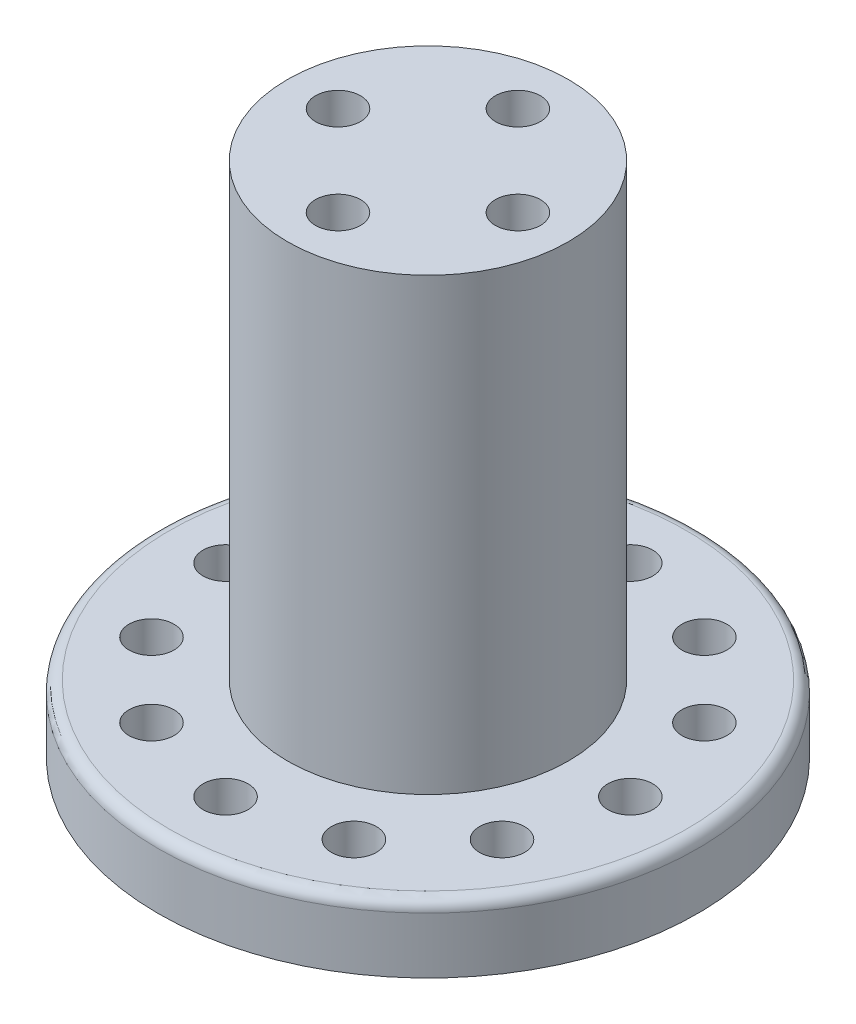
ISO-10303-21;
HEADER;
FILE_DESCRIPTION(('STEP AP214'),'2;1');
FILE_NAME('part.step','',(''),(''),'','','');
FILE_SCHEMA(('AUTOMOTIVE_DESIGN { 1 0 10303 214 1 1 1 1 }'));
ENDSEC;
DATA;
#1=APPLICATION_CONTEXT('core data for automotive mechanical design processes');
#2=APPLICATION_PROTOCOL_DEFINITION('international standard','automotive_design',2000,#1);
#3=PRODUCT_CONTEXT('',#1,'mechanical');
#4=PRODUCT('Part','Part','',(#3));
#5=PRODUCT_RELATED_PRODUCT_CATEGORY('part','',(#4));
#6=PRODUCT_DEFINITION_FORMATION('','',#4);
#7=PRODUCT_DEFINITION_CONTEXT('part definition',#1,'design');
#8=PRODUCT_DEFINITION('design','',#6,#7);
#9=PRODUCT_DEFINITION_SHAPE('','',#8);
#10=(LENGTH_UNIT() NAMED_UNIT(*) SI_UNIT(.MILLI.,.METRE.));
#11=(NAMED_UNIT(*) PLANE_ANGLE_UNIT() SI_UNIT($,.RADIAN.));
#12=(NAMED_UNIT(*) SI_UNIT($,.STERADIAN.) SOLID_ANGLE_UNIT());
#13=UNCERTAINTY_MEASURE_WITH_UNIT(LENGTH_MEASURE(1.E-05),#10,'distance_accuracy_value','');
#14=(GEOMETRIC_REPRESENTATION_CONTEXT(3) GLOBAL_UNCERTAINTY_ASSIGNED_CONTEXT((#13)) GLOBAL_UNIT_ASSIGNED_CONTEXT((#10,
#11,#12)) REPRESENTATION_CONTEXT('',''));
#15=CARTESIAN_POINT('',(0.,0.,0.));
#16=DIRECTION('',(0.,0.,1.));
#17=DIRECTION('',(1.,0.,0.));
#18=AXIS2_PLACEMENT_3D('',#15,#16,#17);
#19=CARTESIAN_POINT('',(0.,6.,0.));
#20=DIRECTION('',(0.,-1.,0.));
#21=DIRECTION('',(0.,0.,-1.));
#22=AXIS2_PLACEMENT_3D('',#19,#20,#21);
#23=CYLINDRICAL_SURFACE('',#22,24.);
#24=CARTESIAN_POINT('',(0.,5.,0.));
#25=DIRECTION('',(0.,1.,0.));
#26=DIRECTION('',(0.,0.,1.));
#27=AXIS2_PLACEMENT_3D('',#24,#25,#26);
#28=CIRCLE('',#27,24.);
#29=CARTESIAN_POINT('',(0.,5.,24.));
#30=VERTEX_POINT('',#29);
#31=EDGE_CURVE('E10',#30,#30,#28,.F.);
#32=ORIENTED_EDGE('',*,*,#31,.T.);
#33=EDGE_LOOP('',(#32));
#34=FACE_BOUND('',#33,.T.);
#35=CARTESIAN_POINT('',(0.,0.,0.));
#36=DIRECTION('',(0.,1.,0.));
#37=DIRECTION('',(0.,0.,1.));
#38=AXIS2_PLACEMENT_3D('',#35,#36,#37);
#39=CIRCLE('',#38,24.);
#40=CARTESIAN_POINT('',(0.,0.,24.));
#41=VERTEX_POINT('',#40);
#42=EDGE_CURVE('E43',#41,#41,#39,.T.);
#43=ORIENTED_EDGE('',*,*,#42,.T.);
#44=EDGE_LOOP('',(#43));
#45=FACE_BOUND('',#44,.T.);
#46=ADVANCED_FACE('F32',(#34,#45),#23,.T.);
#47=CARTESIAN_POINT('',(0.,6.,0.));
#48=DIRECTION('',(0.,1.,0.));
#49=DIRECTION('',(0.,0.,1.));
#50=AXIS2_PLACEMENT_3D('',#47,#48,#49);
#51=PLANE('',#50);
#52=CARTESIAN_POINT('',(0.,6.,0.));
#53=DIRECTION('',(0.,1.,0.));
#54=DIRECTION('',(0.,0.,1.));
#55=AXIS2_PLACEMENT_3D('',#52,#53,#54);
#56=CIRCLE('',#55,23.);
#57=CARTESIAN_POINT('',(0.,6.,23.));
#58=VERTEX_POINT('',#57);
#59=EDGE_CURVE('E39',#58,#58,#56,.T.);
#60=ORIENTED_EDGE('',*,*,#59,.T.);
#61=EDGE_LOOP('',(#60));
#62=FACE_BOUND('',#61,.T.);
#63=CARTESIAN_POINT('',(0.,6.,0.));
#64=DIRECTION('',(0.,1.,0.));
#65=DIRECTION('',(0.,0.,1.));
#66=AXIS2_PLACEMENT_3D('',#63,#64,#65);
#67=CIRCLE('',#66,12.5);
#68=CARTESIAN_POINT('',(0.,6.,12.5));
#69=VERTEX_POINT('',#68);
#70=EDGE_CURVE('E194',#69,#69,#67,.T.);
#71=ORIENTED_EDGE('',*,*,#70,.F.);
#72=EDGE_LOOP('',(#71));
#73=FACE_BOUND('',#72,.T.);
#74=CARTESIAN_POINT('',(-15.5884572681199,6.,9.00000000000001));
#75=DIRECTION('',(0.,1.,0.));
#76=DIRECTION('',(0.,0.,1.));
#77=AXIS2_PLACEMENT_3D('',#74,#75,#76);
#78=CIRCLE('',#77,2.);
#79=CARTESIAN_POINT('',(-15.5884572681199,6.,11.));
#80=VERTEX_POINT('',#79);
#81=EDGE_CURVE('E80',#80,#80,#78,.T.);
#82=ORIENTED_EDGE('',*,*,#81,.F.);
#83=EDGE_LOOP('',(#82));
#84=FACE_BOUND('',#83,.T.);
#85=CARTESIAN_POINT('',(-8.99999999999999,6.,15.5884572681199));
#86=DIRECTION('',(0.,1.,0.));
#87=DIRECTION('',(0.,0.,1.));
#88=AXIS2_PLACEMENT_3D('',#85,#86,#87);
#89=CIRCLE('',#88,2.);
#90=CARTESIAN_POINT('',(-8.99999999999999,6.,17.5884572681199));
#91=VERTEX_POINT('',#90);
#92=EDGE_CURVE('E87',#91,#91,#89,.T.);
#93=ORIENTED_EDGE('',*,*,#92,.F.);
#94=EDGE_LOOP('',(#93));
#95=FACE_BOUND('',#94,.T.);
#96=CARTESIAN_POINT('',(0.,6.,18.));
#97=DIRECTION('',(0.,1.,0.));
#98=DIRECTION('',(0.,0.,1.));
#99=AXIS2_PLACEMENT_3D('',#96,#97,#98);
#100=CIRCLE('',#99,2.);
#101=CARTESIAN_POINT('',(0.,6.,20.));
#102=VERTEX_POINT('',#101);
#103=EDGE_CURVE('E93',#102,#102,#100,.T.);
#104=ORIENTED_EDGE('',*,*,#103,.F.);
#105=EDGE_LOOP('',(#104));
#106=FACE_BOUND('',#105,.T.);
#107=CARTESIAN_POINT('',(9.00000000000001,6.,15.5884572681199));
#108=DIRECTION('',(0.,1.,0.));
#109=DIRECTION('',(0.,0.,1.));
#110=AXIS2_PLACEMENT_3D('',#107,#108,#109);
#111=CIRCLE('',#110,2.);
#112=CARTESIAN_POINT('',(9.00000000000001,6.,17.5884572681199));
#113=VERTEX_POINT('',#112);
#114=EDGE_CURVE('E99',#113,#113,#111,.T.);
#115=ORIENTED_EDGE('',*,*,#114,.F.);
#116=EDGE_LOOP('',(#115));
#117=FACE_BOUND('',#116,.T.);
#118=CARTESIAN_POINT('',(15.5884572681199,6.,8.99999999999999));
#119=DIRECTION('',(0.,1.,0.));
#120=DIRECTION('',(0.,0.,1.));
#121=AXIS2_PLACEMENT_3D('',#118,#119,#120);
#122=CIRCLE('',#121,2.);
#123=CARTESIAN_POINT('',(15.5884572681199,6.,11.));
#124=VERTEX_POINT('',#123);
#125=EDGE_CURVE('E56',#124,#124,#122,.T.);
#126=ORIENTED_EDGE('',*,*,#125,.F.);
#127=EDGE_LOOP('',(#126));
#128=FACE_BOUND('',#127,.T.);
#129=CARTESIAN_POINT('',(18.,6.,0.));
#130=DIRECTION('',(0.,1.,0.));
#131=DIRECTION('',(0.,0.,1.));
#132=AXIS2_PLACEMENT_3D('',#129,#130,#131);
#133=CIRCLE('',#132,2.);
#134=CARTESIAN_POINT('',(18.,6.,2.));
#135=VERTEX_POINT('',#134);
#136=EDGE_CURVE('E63',#135,#135,#133,.T.);
#137=ORIENTED_EDGE('',*,*,#136,.F.);
#138=EDGE_LOOP('',(#137));
#139=FACE_BOUND('',#138,.T.);
#140=CARTESIAN_POINT('',(15.5884572681199,6.,-9.));
#141=DIRECTION('',(0.,1.,0.));
#142=DIRECTION('',(0.,0.,1.));
#143=AXIS2_PLACEMENT_3D('',#140,#141,#142);
#144=CIRCLE('',#143,2.);
#145=CARTESIAN_POINT('',(15.5884572681199,6.,-7.));
#146=VERTEX_POINT('',#145);
#147=EDGE_CURVE('E69',#146,#146,#144,.T.);
#148=ORIENTED_EDGE('',*,*,#147,.F.);
#149=EDGE_LOOP('',(#148));
#150=FACE_BOUND('',#149,.T.);
#151=CARTESIAN_POINT('',(9.,6.,-15.5884572681199));
#152=DIRECTION('',(0.,1.,0.));
#153=DIRECTION('',(0.,0.,1.));
#154=AXIS2_PLACEMENT_3D('',#151,#152,#153);
#155=CIRCLE('',#154,2.);
#156=CARTESIAN_POINT('',(9.,6.,-13.5884572681199));
#157=VERTEX_POINT('',#156);
#158=EDGE_CURVE('E75',#157,#157,#155,.T.);
#159=ORIENTED_EDGE('',*,*,#158,.F.);
#160=EDGE_LOOP('',(#159));
#161=FACE_BOUND('',#160,.T.);
#162=CARTESIAN_POINT('',(-18.,6.,0.));
#163=DIRECTION('',(0.,1.,0.));
#164=DIRECTION('',(0.,0.,1.));
#165=AXIS2_PLACEMENT_3D('',#162,#163,#164);
#166=CIRCLE('',#165,2.);
#167=CARTESIAN_POINT('',(-18.,6.,2.));
#168=VERTEX_POINT('',#167);
#169=EDGE_CURVE('E117',#168,#168,#166,.T.);
#170=ORIENTED_EDGE('',*,*,#169,.F.);
#171=EDGE_LOOP('',(#170));
#172=FACE_BOUND('',#171,.T.);
#173=CARTESIAN_POINT('',(-15.5884572681199,6.,-8.99999999999999));
#174=DIRECTION('',(0.,1.,0.));
#175=DIRECTION('',(0.,0.,1.));
#176=AXIS2_PLACEMENT_3D('',#173,#174,#175);
#177=CIRCLE('',#176,2.);
#178=CARTESIAN_POINT('',(-15.5884572681199,6.,-6.99999999999999));
#179=VERTEX_POINT('',#178);
#180=EDGE_CURVE('E111',#179,#179,#177,.T.);
#181=ORIENTED_EDGE('',*,*,#180,.F.);
#182=EDGE_LOOP('',(#181));
#183=FACE_BOUND('',#182,.T.);
#184=CARTESIAN_POINT('',(-9.00000000000001,6.,-15.5884572681199));
#185=DIRECTION('',(0.,1.,0.));
#186=DIRECTION('',(0.,0.,1.));
#187=AXIS2_PLACEMENT_3D('',#184,#185,#186);
#188=CIRCLE('',#187,2.);
#189=CARTESIAN_POINT('',(-9.00000000000001,6.,-13.5884572681199));
#190=VERTEX_POINT('',#189);
#191=EDGE_CURVE('E104',#190,#190,#188,.T.);
#192=ORIENTED_EDGE('',*,*,#191,.F.);
#193=EDGE_LOOP('',(#192));
#194=FACE_BOUND('',#193,.T.);
#195=CARTESIAN_POINT('',(0.,6.,-18.));
#196=DIRECTION('',(0.,1.,0.));
#197=DIRECTION('',(0.,0.,1.));
#198=AXIS2_PLACEMENT_3D('',#195,#196,#197);
#199=CIRCLE('',#198,2.);
#200=CARTESIAN_POINT('',(0.,6.,-16.));
#201=VERTEX_POINT('',#200);
#202=EDGE_CURVE('E50',#201,#201,#199,.T.);
#203=ORIENTED_EDGE('',*,*,#202,.F.);
#204=EDGE_LOOP('',(#203));
#205=FACE_BOUND('',#204,.T.);
#206=ADVANCED_FACE('F259',(#62,#73,#84,#95,#106,#117,#128,#139,#150,#161,#172,#183,#194,#205),
#51,.T.);
#207=CARTESIAN_POINT('',(0.,0.,0.));
#208=DIRECTION('',(0.,1.,0.));
#209=DIRECTION('',(0.,0.,1.));
#210=AXIS2_PLACEMENT_3D('',#207,#208,#209);
#211=PLANE('',#210);
#212=CARTESIAN_POINT('',(0.,0.,0.));
#213=DIRECTION('',(0.,-1.,0.));
#214=DIRECTION('',(0.,0.,-1.));
#215=AXIS2_PLACEMENT_3D('',#212,#213,#214);
#216=CIRCLE('',#215,8.5);
#217=CARTESIAN_POINT('',(0.,0.,-8.5));
#218=VERTEX_POINT('',#217);
#219=EDGE_CURVE('E200',#218,#218,#216,.T.);
#220=ORIENTED_EDGE('',*,*,#219,.F.);
#221=EDGE_LOOP('',(#220));
#222=FACE_BOUND('',#221,.T.);
#223=CARTESIAN_POINT('',(-15.5884572681199,0.,9.00000000000001));
#224=DIRECTION('',(0.,1.,0.));
#225=DIRECTION('',(0.,0.,1.));
#226=AXIS2_PLACEMENT_3D('',#223,#224,#225);
#227=CIRCLE('',#226,1.25);
#228=CARTESIAN_POINT('',(-15.5884572681199,0.,10.25));
#229=VERTEX_POINT('',#228);
#230=EDGE_CURVE('E155',#229,#229,#227,.T.);
#231=ORIENTED_EDGE('',*,*,#230,.T.);
#232=EDGE_LOOP('',(#231));
#233=FACE_BOUND('',#232,.T.);
#234=CARTESIAN_POINT('',(-8.99999999999999,0.,15.5884572681199));
#235=DIRECTION('',(0.,1.,0.));
#236=DIRECTION('',(0.,0.,1.));
#237=AXIS2_PLACEMENT_3D('',#234,#235,#236);
#238=CIRCLE('',#237,1.25);
#239=CARTESIAN_POINT('',(-8.99999999999999,0.,16.8384572681199));
#240=VERTEX_POINT('',#239);
#241=EDGE_CURVE('E162',#240,#240,#238,.T.);
#242=ORIENTED_EDGE('',*,*,#241,.T.);
#243=EDGE_LOOP('',(#242));
#244=FACE_BOUND('',#243,.T.);
#245=CARTESIAN_POINT('',(0.,0.,18.));
#246=DIRECTION('',(0.,1.,0.));
#247=DIRECTION('',(0.,0.,1.));
#248=AXIS2_PLACEMENT_3D('',#245,#246,#247);
#249=CIRCLE('',#248,1.25);
#250=CARTESIAN_POINT('',(0.,0.,19.25));
#251=VERTEX_POINT('',#250);
#252=EDGE_CURVE('E168',#251,#251,#249,.T.);
#253=ORIENTED_EDGE('',*,*,#252,.T.);
#254=EDGE_LOOP('',(#253));
#255=FACE_BOUND('',#254,.T.);
#256=CARTESIAN_POINT('',(9.00000000000001,0.,15.5884572681199));
#257=DIRECTION('',(0.,1.,0.));
#258=DIRECTION('',(0.,0.,1.));
#259=AXIS2_PLACEMENT_3D('',#256,#257,#258);
#260=CIRCLE('',#259,1.25);
#261=CARTESIAN_POINT('',(9.00000000000001,0.,16.8384572681199));
#262=VERTEX_POINT('',#261);
#263=EDGE_CURVE('E132',#262,#262,#260,.T.);
#264=ORIENTED_EDGE('',*,*,#263,.T.);
#265=EDGE_LOOP('',(#264));
#266=FACE_BOUND('',#265,.T.);
#267=CARTESIAN_POINT('',(15.5884572681199,0.,9.));
#268=DIRECTION('',(0.,1.,0.));
#269=DIRECTION('',(0.,0.,1.));
#270=AXIS2_PLACEMENT_3D('',#267,#268,#269);
#271=CIRCLE('',#270,1.25);
#272=CARTESIAN_POINT('',(15.5884572681199,0.,10.25));
#273=VERTEX_POINT('',#272);
#274=EDGE_CURVE('E131',#273,#273,#271,.T.);
#275=ORIENTED_EDGE('',*,*,#274,.T.);
#276=EDGE_LOOP('',(#275));
#277=FACE_BOUND('',#276,.T.);
#278=CARTESIAN_POINT('',(18.,0.,0.));
#279=DIRECTION('',(0.,1.,0.));
#280=DIRECTION('',(0.,0.,1.));
#281=AXIS2_PLACEMENT_3D('',#278,#279,#280);
#282=CIRCLE('',#281,1.25);
#283=CARTESIAN_POINT('',(18.,0.,1.25));
#284=VERTEX_POINT('',#283);
#285=EDGE_CURVE('E138',#284,#284,#282,.T.);
#286=ORIENTED_EDGE('',*,*,#285,.T.);
#287=EDGE_LOOP('',(#286));
#288=FACE_BOUND('',#287,.T.);
#289=CARTESIAN_POINT('',(15.5884572681199,0.,-9.));
#290=DIRECTION('',(0.,1.,0.));
#291=DIRECTION('',(0.,0.,1.));
#292=AXIS2_PLACEMENT_3D('',#289,#290,#291);
#293=CIRCLE('',#292,1.25);
#294=CARTESIAN_POINT('',(15.5884572681199,0.,-7.75));
#295=VERTEX_POINT('',#294);
#296=EDGE_CURVE('E144',#295,#295,#293,.T.);
#297=ORIENTED_EDGE('',*,*,#296,.T.);
#298=EDGE_LOOP('',(#297));
#299=FACE_BOUND('',#298,.T.);
#300=CARTESIAN_POINT('',(9.,0.,-15.5884572681199));
#301=DIRECTION('',(0.,1.,0.));
#302=DIRECTION('',(0.,0.,1.));
#303=AXIS2_PLACEMENT_3D('',#300,#301,#302);
#304=CIRCLE('',#303,1.25);
#305=CARTESIAN_POINT('',(9.,0.,-14.3384572681199));
#306=VERTEX_POINT('',#305);
#307=EDGE_CURVE('E125',#306,#306,#304,.T.);
#308=ORIENTED_EDGE('',*,*,#307,.T.);
#309=EDGE_LOOP('',(#308));
#310=FACE_BOUND('',#309,.T.);
#311=CARTESIAN_POINT('',(-18.,0.,0.));
#312=DIRECTION('',(0.,1.,0.));
#313=DIRECTION('',(0.,0.,1.));
#314=AXIS2_PLACEMENT_3D('',#311,#312,#313);
#315=CIRCLE('',#314,1.25);
#316=CARTESIAN_POINT('',(-18.,0.,1.25));
#317=VERTEX_POINT('',#316);
#318=EDGE_CURVE('E156',#317,#317,#315,.T.);
#319=ORIENTED_EDGE('',*,*,#318,.T.);
#320=EDGE_LOOP('',(#319));
#321=FACE_BOUND('',#320,.T.);
#322=CARTESIAN_POINT('',(-15.5884572681199,0.,-8.99999999999999));
#323=DIRECTION('',(0.,1.,0.));
#324=DIRECTION('',(0.,0.,1.));
#325=AXIS2_PLACEMENT_3D('',#322,#323,#324);
#326=CIRCLE('',#325,1.25);
#327=CARTESIAN_POINT('',(-15.5884572681199,0.,-7.74999999999999));
#328=VERTEX_POINT('',#327);
#329=EDGE_CURVE('E186',#328,#328,#326,.T.);
#330=ORIENTED_EDGE('',*,*,#329,.T.);
#331=EDGE_LOOP('',(#330));
#332=FACE_BOUND('',#331,.T.);
#333=CARTESIAN_POINT('',(-9.00000000000001,0.,-15.5884572681199));
#334=DIRECTION('',(0.,1.,0.));
#335=DIRECTION('',(0.,0.,1.));
#336=AXIS2_PLACEMENT_3D('',#333,#334,#335);
#337=CIRCLE('',#336,1.25);
#338=CARTESIAN_POINT('',(-9.00000000000001,0.,-14.3384572681199));
#339=VERTEX_POINT('',#338);
#340=EDGE_CURVE('E179',#339,#339,#337,.T.);
#341=ORIENTED_EDGE('',*,*,#340,.T.);
#342=EDGE_LOOP('',(#341));
#343=FACE_BOUND('',#342,.T.);
#344=CARTESIAN_POINT('',(0.,0.,-18.));
#345=DIRECTION('',(0.,1.,0.));
#346=DIRECTION('',(0.,0.,1.));
#347=AXIS2_PLACEMENT_3D('',#344,#345,#346);
#348=CIRCLE('',#347,1.25);
#349=CARTESIAN_POINT('',(0.,0.,-16.75));
#350=VERTEX_POINT('',#349);
#351=EDGE_CURVE('E108',#350,#350,#348,.T.);
#352=ORIENTED_EDGE('',*,*,#351,.T.);
#353=EDGE_LOOP('',(#352));
#354=FACE_BOUND('',#353,.T.);
#355=ORIENTED_EDGE('',*,*,#42,.F.);
#356=EDGE_LOOP('',(#355));
#357=FACE_BOUND('',#356,.T.);
#358=ADVANCED_FACE('F262',(#222,#233,#244,#255,#266,#277,#288,#299,#310,#321,#332,#343,#354,
#357),#211,.F.);
#359=CARTESIAN_POINT('',(0.,2.,-18.));
#360=DIRECTION('',(0.,1.,0.));
#361=DIRECTION('',(0.,0.,1.));
#362=AXIS2_PLACEMENT_3D('',#359,#360,#361);
#363=CYLINDRICAL_SURFACE('',#362,2.);
#364=CARTESIAN_POINT('',(0.,2.,-18.));
#365=DIRECTION('',(0.,1.,0.));
#366=DIRECTION('',(0.,0.,1.));
#367=AXIS2_PLACEMENT_3D('',#364,#365,#366);
#368=CIRCLE('',#367,2.);
#369=CARTESIAN_POINT('',(0.,2.,-16.));
#370=VERTEX_POINT('',#369);
#371=EDGE_CURVE('E47',#370,#370,#368,.T.);
#372=ORIENTED_EDGE('',*,*,#371,.F.);
#373=EDGE_LOOP('',(#372));
#374=FACE_BOUND('',#373,.T.);
#375=ORIENTED_EDGE('',*,*,#202,.T.);
#376=EDGE_LOOP('',(#375));
#377=FACE_BOUND('',#376,.T.);
#378=ADVANCED_FACE('F288',(#374,#377),#363,.F.);
#379=CARTESIAN_POINT('',(0.,2.,-18.));
#380=DIRECTION('',(0.,1.,0.));
#381=DIRECTION('',(0.,0.,1.));
#382=AXIS2_PLACEMENT_3D('',#379,#380,#381);
#383=PLANE('',#382);
#384=CARTESIAN_POINT('',(0.,2.,-18.));
#385=DIRECTION('',(0.,1.,0.));
#386=DIRECTION('',(0.,0.,1.));
#387=AXIS2_PLACEMENT_3D('',#384,#385,#386);
#388=CIRCLE('',#387,1.25);
#389=CARTESIAN_POINT('',(0.,2.,-16.75));
#390=VERTEX_POINT('',#389);
#391=EDGE_CURVE('E122',#390,#390,#388,.T.);
#392=ORIENTED_EDGE('',*,*,#391,.F.);
#393=EDGE_LOOP('',(#392));
#394=FACE_BOUND('',#393,.T.);
#395=ORIENTED_EDGE('',*,*,#371,.T.);
#396=EDGE_LOOP('',(#395));
#397=FACE_BOUND('',#396,.T.);
#398=ADVANCED_FACE('F290',(#394,#397),#383,.T.);
#399=CARTESIAN_POINT('',(-9.00000000000001,2.,-15.5884572681199));
#400=DIRECTION('',(0.,1.,0.));
#401=DIRECTION('',(0.,0.,1.));
#402=AXIS2_PLACEMENT_3D('',#399,#400,#401);
#403=CYLINDRICAL_SURFACE('',#402,2.);
#404=CARTESIAN_POINT('',(-9.00000000000001,2.,-15.5884572681199));
#405=DIRECTION('',(0.,1.,0.));
#406=DIRECTION('',(0.,0.,1.));
#407=AXIS2_PLACEMENT_3D('',#404,#405,#406);
#408=CIRCLE('',#407,2.);
#409=CARTESIAN_POINT('',(-9.00000000000001,2.,-13.5884572681199));
#410=VERTEX_POINT('',#409);
#411=EDGE_CURVE('E107',#410,#410,#408,.T.);
#412=ORIENTED_EDGE('',*,*,#411,.F.);
#413=EDGE_LOOP('',(#412));
#414=FACE_BOUND('',#413,.T.);
#415=ORIENTED_EDGE('',*,*,#191,.T.);
#416=EDGE_LOOP('',(#415));
#417=FACE_BOUND('',#416,.T.);
#418=ADVANCED_FACE('F297',(#414,#417),#403,.F.);
#419=CARTESIAN_POINT('',(-9.00000000000001,2.,-15.5884572681199));
#420=DIRECTION('',(0.,1.,0.));
#421=DIRECTION('',(0.,0.,1.));
#422=AXIS2_PLACEMENT_3D('',#419,#420,#421);
#423=PLANE('',#422);
#424=CARTESIAN_POINT('',(-9.00000000000001,2.,-15.5884572681199));
#425=DIRECTION('',(0.,1.,0.));
#426=DIRECTION('',(0.,0.,1.));
#427=AXIS2_PLACEMENT_3D('',#424,#425,#426);
#428=CIRCLE('',#427,1.25);
#429=CARTESIAN_POINT('',(-9.00000000000001,2.,-14.3384572681199));
#430=VERTEX_POINT('',#429);
#431=EDGE_CURVE('E176',#430,#430,#428,.T.);
#432=ORIENTED_EDGE('',*,*,#431,.F.);
#433=EDGE_LOOP('',(#432));
#434=FACE_BOUND('',#433,.T.);
#435=ORIENTED_EDGE('',*,*,#411,.T.);
#436=EDGE_LOOP('',(#435));
#437=FACE_BOUND('',#436,.T.);
#438=ADVANCED_FACE('F493',(#434,#437),#423,.T.);
#439=CARTESIAN_POINT('',(-15.5884572681199,2.,-8.99999999999999));
#440=DIRECTION('',(0.,1.,0.));
#441=DIRECTION('',(0.,0.,1.));
#442=AXIS2_PLACEMENT_3D('',#439,#440,#441);
#443=CYLINDRICAL_SURFACE('',#442,2.);
#444=CARTESIAN_POINT('',(-15.5884572681199,2.,-8.99999999999999));
#445=DIRECTION('',(0.,1.,0.));
#446=DIRECTION('',(0.,0.,1.));
#447=AXIS2_PLACEMENT_3D('',#444,#445,#446);
#448=CIRCLE('',#447,2.);
#449=CARTESIAN_POINT('',(-15.5884572681199,2.,-6.99999999999999));
#450=VERTEX_POINT('',#449);
#451=EDGE_CURVE('E114',#450,#450,#448,.T.);
#452=ORIENTED_EDGE('',*,*,#451,.F.);
#453=EDGE_LOOP('',(#452));
#454=FACE_BOUND('',#453,.T.);
#455=ORIENTED_EDGE('',*,*,#180,.T.);
#456=EDGE_LOOP('',(#455));
#457=FACE_BOUND('',#456,.T.);
#458=ADVANCED_FACE('F489',(#454,#457),#443,.F.);
#459=CARTESIAN_POINT('',(-15.5884572681199,2.,-8.99999999999999));
#460=DIRECTION('',(0.,1.,0.));
#461=DIRECTION('',(0.,0.,1.));
#462=AXIS2_PLACEMENT_3D('',#459,#460,#461);
#463=PLANE('',#462);
#464=CARTESIAN_POINT('',(-15.5884572681199,2.,-8.99999999999999));
#465=DIRECTION('',(0.,1.,0.));
#466=DIRECTION('',(0.,0.,1.));
#467=AXIS2_PLACEMENT_3D('',#464,#465,#466);
#468=CIRCLE('',#467,1.25);
#469=CARTESIAN_POINT('',(-15.5884572681199,2.,-7.74999999999999));
#470=VERTEX_POINT('',#469);
#471=EDGE_CURVE('E183',#470,#470,#468,.T.);
#472=ORIENTED_EDGE('',*,*,#471,.F.);
#473=EDGE_LOOP('',(#472));
#474=FACE_BOUND('',#473,.T.);
#475=ORIENTED_EDGE('',*,*,#451,.T.);
#476=EDGE_LOOP('',(#475));
#477=FACE_BOUND('',#476,.T.);
#478=ADVANCED_FACE('F485',(#474,#477),#463,.T.);
#479=CARTESIAN_POINT('',(-18.,2.,0.));
#480=DIRECTION('',(0.,1.,0.));
#481=DIRECTION('',(0.,0.,1.));
#482=AXIS2_PLACEMENT_3D('',#479,#480,#481);
#483=CYLINDRICAL_SURFACE('',#482,2.);
#484=CARTESIAN_POINT('',(-18.,2.,0.));
#485=DIRECTION('',(0.,1.,0.));
#486=DIRECTION('',(0.,0.,1.));
#487=AXIS2_PLACEMENT_3D('',#484,#485,#486);
#488=CIRCLE('',#487,2.);
#489=CARTESIAN_POINT('',(-18.,2.,2.));
#490=VERTEX_POINT('',#489);
#491=EDGE_CURVE('E84',#490,#490,#488,.T.);
#492=ORIENTED_EDGE('',*,*,#491,.F.);
#493=EDGE_LOOP('',(#492));
#494=FACE_BOUND('',#493,.T.);
#495=ORIENTED_EDGE('',*,*,#169,.T.);
#496=EDGE_LOOP('',(#495));
#497=FACE_BOUND('',#496,.T.);
#498=ADVANCED_FACE('F481',(#494,#497),#483,.F.);
#499=CARTESIAN_POINT('',(-18.,2.,0.));
#500=DIRECTION('',(0.,1.,0.));
#501=DIRECTION('',(0.,0.,1.));
#502=AXIS2_PLACEMENT_3D('',#499,#500,#501);
#503=PLANE('',#502);
#504=CARTESIAN_POINT('',(-18.,2.,0.));
#505=DIRECTION('',(0.,1.,0.));
#506=DIRECTION('',(0.,0.,1.));
#507=AXIS2_PLACEMENT_3D('',#504,#505,#506);
#508=CIRCLE('',#507,1.25);
#509=CARTESIAN_POINT('',(-18.,2.,1.25));
#510=VERTEX_POINT('',#509);
#511=EDGE_CURVE('E189',#510,#510,#508,.T.);
#512=ORIENTED_EDGE('',*,*,#511,.F.);
#513=EDGE_LOOP('',(#512));
#514=FACE_BOUND('',#513,.T.);
#515=ORIENTED_EDGE('',*,*,#491,.T.);
#516=EDGE_LOOP('',(#515));
#517=FACE_BOUND('',#516,.T.);
#518=ADVANCED_FACE('F477',(#514,#517),#503,.T.);
#519=CARTESIAN_POINT('',(9.,2.,-15.5884572681199));
#520=DIRECTION('',(0.,1.,0.));
#521=DIRECTION('',(0.,0.,1.));
#522=AXIS2_PLACEMENT_3D('',#519,#520,#521);
#523=CYLINDRICAL_SURFACE('',#522,2.);
#524=CARTESIAN_POINT('',(9.,2.,-15.5884572681199));
#525=DIRECTION('',(0.,1.,0.));
#526=DIRECTION('',(0.,0.,1.));
#527=AXIS2_PLACEMENT_3D('',#524,#525,#526);
#528=CIRCLE('',#527,2.);
#529=CARTESIAN_POINT('',(9.,2.,-13.5884572681199));
#530=VERTEX_POINT('',#529);
#531=EDGE_CURVE('E53',#530,#530,#528,.T.);
#532=ORIENTED_EDGE('',*,*,#531,.F.);
#533=EDGE_LOOP('',(#532));
#534=FACE_BOUND('',#533,.T.);
#535=ORIENTED_EDGE('',*,*,#158,.T.);
#536=EDGE_LOOP('',(#535));
#537=FACE_BOUND('',#536,.T.);
#538=ADVANCED_FACE('F480',(#534,#537),#523,.F.);
#539=CARTESIAN_POINT('',(9.,2.,-15.5884572681199));
#540=DIRECTION('',(0.,1.,0.));
#541=DIRECTION('',(0.,0.,1.));
#542=AXIS2_PLACEMENT_3D('',#539,#540,#541);
#543=PLANE('',#542);
#544=CARTESIAN_POINT('',(9.,2.,-15.5884572681199));
#545=DIRECTION('',(0.,1.,0.));
#546=DIRECTION('',(0.,0.,1.));
#547=AXIS2_PLACEMENT_3D('',#544,#545,#546);
#548=CIRCLE('',#547,1.25);
#549=CARTESIAN_POINT('',(9.,2.,-14.3384572681199));
#550=VERTEX_POINT('',#549);
#551=EDGE_CURVE('E147',#550,#550,#548,.T.);
#552=ORIENTED_EDGE('',*,*,#551,.F.);
#553=EDGE_LOOP('',(#552));
#554=FACE_BOUND('',#553,.T.);
#555=ORIENTED_EDGE('',*,*,#531,.T.);
#556=EDGE_LOOP('',(#555));
#557=FACE_BOUND('',#556,.T.);
#558=ADVANCED_FACE('F533',(#554,#557),#543,.T.);
#559=CARTESIAN_POINT('',(15.5884572681199,2.,-9.));
#560=DIRECTION('',(0.,1.,0.));
#561=DIRECTION('',(0.,0.,1.));
#562=AXIS2_PLACEMENT_3D('',#559,#560,#561);
#563=CYLINDRICAL_SURFACE('',#562,2.);
#564=CARTESIAN_POINT('',(15.5884572681199,2.,-9.));
#565=DIRECTION('',(0.,1.,0.));
#566=DIRECTION('',(0.,0.,1.));
#567=AXIS2_PLACEMENT_3D('',#564,#565,#566);
#568=CIRCLE('',#567,2.);
#569=CARTESIAN_POINT('',(15.5884572681199,2.,-7.));
#570=VERTEX_POINT('',#569);
#571=EDGE_CURVE('E72',#570,#570,#568,.T.);
#572=ORIENTED_EDGE('',*,*,#571,.F.);
#573=EDGE_LOOP('',(#572));
#574=FACE_BOUND('',#573,.T.);
#575=ORIENTED_EDGE('',*,*,#147,.T.);
#576=EDGE_LOOP('',(#575));
#577=FACE_BOUND('',#576,.T.);
#578=ADVANCED_FACE('F536',(#574,#577),#563,.F.);
#579=CARTESIAN_POINT('',(15.5884572681199,2.,-9.));
#580=DIRECTION('',(0.,1.,0.));
#581=DIRECTION('',(0.,0.,1.));
#582=AXIS2_PLACEMENT_3D('',#579,#580,#581);
#583=PLANE('',#582);
#584=CARTESIAN_POINT('',(15.5884572681199,2.,-9.));
#585=DIRECTION('',(0.,1.,0.));
#586=DIRECTION('',(0.,0.,1.));
#587=AXIS2_PLACEMENT_3D('',#584,#585,#586);
#588=CIRCLE('',#587,1.25);
#589=CARTESIAN_POINT('',(15.5884572681199,2.,-7.75));
#590=VERTEX_POINT('',#589);
#591=EDGE_CURVE('E141',#590,#590,#588,.T.);
#592=ORIENTED_EDGE('',*,*,#591,.F.);
#593=EDGE_LOOP('',(#592));
#594=FACE_BOUND('',#593,.T.);
#595=ORIENTED_EDGE('',*,*,#571,.T.);
#596=EDGE_LOOP('',(#595));
#597=FACE_BOUND('',#596,.T.);
#598=ADVANCED_FACE('F541',(#594,#597),#583,.T.);
#599=CARTESIAN_POINT('',(18.,2.,0.));
#600=DIRECTION('',(0.,1.,0.));
#601=DIRECTION('',(0.,0.,1.));
#602=AXIS2_PLACEMENT_3D('',#599,#600,#601);
#603=CYLINDRICAL_SURFACE('',#602,2.);
#604=CARTESIAN_POINT('',(18.,2.,0.));
#605=DIRECTION('',(0.,1.,0.));
#606=DIRECTION('',(0.,0.,1.));
#607=AXIS2_PLACEMENT_3D('',#604,#605,#606);
#608=CIRCLE('',#607,2.);
#609=CARTESIAN_POINT('',(18.,2.,2.));
#610=VERTEX_POINT('',#609);
#611=EDGE_CURVE('E66',#610,#610,#608,.T.);
#612=ORIENTED_EDGE('',*,*,#611,.F.);
#613=EDGE_LOOP('',(#612));
#614=FACE_BOUND('',#613,.T.);
#615=ORIENTED_EDGE('',*,*,#136,.T.);
#616=EDGE_LOOP('',(#615));
#617=FACE_BOUND('',#616,.T.);
#618=ADVANCED_FACE('F544',(#614,#617),#603,.F.);
#619=CARTESIAN_POINT('',(18.,2.,0.));
#620=DIRECTION('',(0.,1.,0.));
#621=DIRECTION('',(0.,0.,1.));
#622=AXIS2_PLACEMENT_3D('',#619,#620,#621);
#623=PLANE('',#622);
#624=CARTESIAN_POINT('',(18.,2.,0.));
#625=DIRECTION('',(0.,1.,0.));
#626=DIRECTION('',(0.,0.,1.));
#627=AXIS2_PLACEMENT_3D('',#624,#625,#626);
#628=CIRCLE('',#627,1.25);
#629=CARTESIAN_POINT('',(18.,2.,1.25));
#630=VERTEX_POINT('',#629);
#631=EDGE_CURVE('E135',#630,#630,#628,.T.);
#632=ORIENTED_EDGE('',*,*,#631,.F.);
#633=EDGE_LOOP('',(#632));
#634=FACE_BOUND('',#633,.T.);
#635=ORIENTED_EDGE('',*,*,#611,.T.);
#636=EDGE_LOOP('',(#635));
#637=FACE_BOUND('',#636,.T.);
#638=ADVANCED_FACE('F549',(#634,#637),#623,.T.);
#639=CARTESIAN_POINT('',(15.5884572681199,2.,8.99999999999999));
#640=DIRECTION('',(0.,1.,0.));
#641=DIRECTION('',(0.,0.,1.));
#642=AXIS2_PLACEMENT_3D('',#639,#640,#641);
#643=CYLINDRICAL_SURFACE('',#642,2.);
#644=CARTESIAN_POINT('',(15.5884572681199,2.,8.99999999999999));
#645=DIRECTION('',(0.,1.,0.));
#646=DIRECTION('',(0.,0.,1.));
#647=AXIS2_PLACEMENT_3D('',#644,#645,#646);
#648=CIRCLE('',#647,2.);
#649=CARTESIAN_POINT('',(15.5884572681199,2.,11.));
#650=VERTEX_POINT('',#649);
#651=EDGE_CURVE('E59',#650,#650,#648,.T.);
#652=ORIENTED_EDGE('',*,*,#651,.F.);
#653=EDGE_LOOP('',(#652));
#654=FACE_BOUND('',#653,.T.);
#655=ORIENTED_EDGE('',*,*,#125,.T.);
#656=EDGE_LOOP('',(#655));
#657=FACE_BOUND('',#656,.T.);
#658=ADVANCED_FACE('F552',(#654,#657),#643,.F.);
#659=CARTESIAN_POINT('',(15.5884572681199,2.,8.99999999999999));
#660=DIRECTION('',(0.,1.,0.));
#661=DIRECTION('',(0.,0.,1.));
#662=AXIS2_PLACEMENT_3D('',#659,#660,#661);
#663=PLANE('',#662);
#664=CARTESIAN_POINT('',(15.5884572681199,2.,9.));
#665=DIRECTION('',(0.,1.,0.));
#666=DIRECTION('',(0.,0.,1.));
#667=AXIS2_PLACEMENT_3D('',#664,#665,#666);
#668=CIRCLE('',#667,1.25);
#669=CARTESIAN_POINT('',(15.5884572681199,2.,10.25));
#670=VERTEX_POINT('',#669);
#671=EDGE_CURVE('E128',#670,#670,#668,.T.);
#672=ORIENTED_EDGE('',*,*,#671,.F.);
#673=EDGE_LOOP('',(#672));
#674=FACE_BOUND('',#673,.T.);
#675=ORIENTED_EDGE('',*,*,#651,.T.);
#676=EDGE_LOOP('',(#675));
#677=FACE_BOUND('',#676,.T.);
#678=ADVANCED_FACE('F509',(#674,#677),#663,.T.);
#679=CARTESIAN_POINT('',(9.00000000000001,2.,15.5884572681199));
#680=DIRECTION('',(0.,1.,0.));
#681=DIRECTION('',(0.,0.,1.));
#682=AXIS2_PLACEMENT_3D('',#679,#680,#681);
#683=CYLINDRICAL_SURFACE('',#682,2.);
#684=CARTESIAN_POINT('',(9.00000000000001,2.,15.5884572681199));
#685=DIRECTION('',(0.,1.,0.));
#686=DIRECTION('',(0.,0.,1.));
#687=AXIS2_PLACEMENT_3D('',#684,#685,#686);
#688=CIRCLE('',#687,2.);
#689=CARTESIAN_POINT('',(9.00000000000001,2.,17.5884572681199));
#690=VERTEX_POINT('',#689);
#691=EDGE_CURVE('E60',#690,#690,#688,.T.);
#692=ORIENTED_EDGE('',*,*,#691,.F.);
#693=EDGE_LOOP('',(#692));
#694=FACE_BOUND('',#693,.T.);
#695=ORIENTED_EDGE('',*,*,#114,.T.);
#696=EDGE_LOOP('',(#695));
#697=FACE_BOUND('',#696,.T.);
#698=ADVANCED_FACE('F505',(#694,#697),#683,.F.);
#699=CARTESIAN_POINT('',(9.00000000000001,2.,15.5884572681199));
#700=DIRECTION('',(0.,1.,0.));
#701=DIRECTION('',(0.,0.,1.));
#702=AXIS2_PLACEMENT_3D('',#699,#700,#701);
#703=PLANE('',#702);
#704=CARTESIAN_POINT('',(9.00000000000001,2.,15.5884572681199));
#705=DIRECTION('',(0.,1.,0.));
#706=DIRECTION('',(0.,0.,1.));
#707=AXIS2_PLACEMENT_3D('',#704,#705,#706);
#708=CIRCLE('',#707,1.25);
#709=CARTESIAN_POINT('',(9.00000000000001,2.,16.8384572681199));
#710=VERTEX_POINT('',#709);
#711=EDGE_CURVE('E171',#710,#710,#708,.T.);
#712=ORIENTED_EDGE('',*,*,#711,.F.);
#713=EDGE_LOOP('',(#712));
#714=FACE_BOUND('',#713,.T.);
#715=ORIENTED_EDGE('',*,*,#691,.T.);
#716=EDGE_LOOP('',(#715));
#717=FACE_BOUND('',#716,.T.);
#718=ADVANCED_FACE('F501',(#714,#717),#703,.T.);
#719=CARTESIAN_POINT('',(0.,2.,18.));
#720=DIRECTION('',(0.,1.,0.));
#721=DIRECTION('',(0.,0.,1.));
#722=AXIS2_PLACEMENT_3D('',#719,#720,#721);
#723=CYLINDRICAL_SURFACE('',#722,2.);
#724=CARTESIAN_POINT('',(0.,2.,18.));
#725=DIRECTION('',(0.,1.,0.));
#726=DIRECTION('',(0.,0.,1.));
#727=AXIS2_PLACEMENT_3D('',#724,#725,#726);
#728=CIRCLE('',#727,2.);
#729=CARTESIAN_POINT('',(0.,2.,20.));
#730=VERTEX_POINT('',#729);
#731=EDGE_CURVE('E96',#730,#730,#728,.T.);
#732=ORIENTED_EDGE('',*,*,#731,.F.);
#733=EDGE_LOOP('',(#732));
#734=FACE_BOUND('',#733,.T.);
#735=ORIENTED_EDGE('',*,*,#103,.T.);
#736=EDGE_LOOP('',(#735));
#737=FACE_BOUND('',#736,.T.);
#738=ADVANCED_FACE('F504',(#734,#737),#723,.F.);
#739=CARTESIAN_POINT('',(0.,2.,18.));
#740=DIRECTION('',(0.,1.,0.));
#741=DIRECTION('',(0.,0.,1.));
#742=AXIS2_PLACEMENT_3D('',#739,#740,#741);
#743=PLANE('',#742);
#744=CARTESIAN_POINT('',(0.,2.,18.));
#745=DIRECTION('',(0.,1.,0.));
#746=DIRECTION('',(0.,0.,1.));
#747=AXIS2_PLACEMENT_3D('',#744,#745,#746);
#748=CIRCLE('',#747,1.25);
#749=CARTESIAN_POINT('',(0.,2.,19.25));
#750=VERTEX_POINT('',#749);
#751=EDGE_CURVE('E165',#750,#750,#748,.T.);
#752=ORIENTED_EDGE('',*,*,#751,.F.);
#753=EDGE_LOOP('',(#752));
#754=FACE_BOUND('',#753,.T.);
#755=ORIENTED_EDGE('',*,*,#731,.T.);
#756=EDGE_LOOP('',(#755));
#757=FACE_BOUND('',#756,.T.);
#758=ADVANCED_FACE('F511',(#754,#757),#743,.T.);
#759=CARTESIAN_POINT('',(-8.99999999999999,2.,15.5884572681199));
#760=DIRECTION('',(0.,1.,0.));
#761=DIRECTION('',(0.,0.,1.));
#762=AXIS2_PLACEMENT_3D('',#759,#760,#761);
#763=CYLINDRICAL_SURFACE('',#762,2.);
#764=CARTESIAN_POINT('',(-8.99999999999999,2.,15.5884572681199));
#765=DIRECTION('',(0.,1.,0.));
#766=DIRECTION('',(0.,0.,1.));
#767=AXIS2_PLACEMENT_3D('',#764,#765,#766);
#768=CIRCLE('',#767,2.);
#769=CARTESIAN_POINT('',(-8.99999999999999,2.,17.5884572681199));
#770=VERTEX_POINT('',#769);
#771=EDGE_CURVE('E90',#770,#770,#768,.T.);
#772=ORIENTED_EDGE('',*,*,#771,.F.);
#773=EDGE_LOOP('',(#772));
#774=FACE_BOUND('',#773,.T.);
#775=ORIENTED_EDGE('',*,*,#92,.T.);
#776=EDGE_LOOP('',(#775));
#777=FACE_BOUND('',#776,.T.);
#778=ADVANCED_FACE('F514',(#774,#777),#763,.F.);
#779=CARTESIAN_POINT('',(-8.99999999999999,2.,15.5884572681199));
#780=DIRECTION('',(0.,1.,0.));
#781=DIRECTION('',(0.,0.,1.));
#782=AXIS2_PLACEMENT_3D('',#779,#780,#781);
#783=PLANE('',#782);
#784=CARTESIAN_POINT('',(-8.99999999999999,2.,15.5884572681199));
#785=DIRECTION('',(0.,1.,0.));
#786=DIRECTION('',(0.,0.,1.));
#787=AXIS2_PLACEMENT_3D('',#784,#785,#786);
#788=CIRCLE('',#787,1.25);
#789=CARTESIAN_POINT('',(-8.99999999999999,2.,16.8384572681199));
#790=VERTEX_POINT('',#789);
#791=EDGE_CURVE('E159',#790,#790,#788,.T.);
#792=ORIENTED_EDGE('',*,*,#791,.F.);
#793=EDGE_LOOP('',(#792));
#794=FACE_BOUND('',#793,.T.);
#795=ORIENTED_EDGE('',*,*,#771,.T.);
#796=EDGE_LOOP('',(#795));
#797=FACE_BOUND('',#796,.T.);
#798=ADVANCED_FACE('F519',(#794,#797),#783,.T.);
#799=CARTESIAN_POINT('',(-15.5884572681199,2.,9.00000000000001));
#800=DIRECTION('',(0.,1.,0.));
#801=DIRECTION('',(0.,0.,1.));
#802=AXIS2_PLACEMENT_3D('',#799,#800,#801);
#803=CYLINDRICAL_SURFACE('',#802,2.);
#804=CARTESIAN_POINT('',(-15.5884572681199,2.,9.00000000000001));
#805=DIRECTION('',(0.,1.,0.));
#806=DIRECTION('',(0.,0.,1.));
#807=AXIS2_PLACEMENT_3D('',#804,#805,#806);
#808=CIRCLE('',#807,2.);
#809=CARTESIAN_POINT('',(-15.5884572681199,2.,11.));
#810=VERTEX_POINT('',#809);
#811=EDGE_CURVE('E83',#810,#810,#808,.T.);
#812=ORIENTED_EDGE('',*,*,#811,.F.);
#813=EDGE_LOOP('',(#812));
#814=FACE_BOUND('',#813,.T.);
#815=ORIENTED_EDGE('',*,*,#81,.T.);
#816=EDGE_LOOP('',(#815));
#817=FACE_BOUND('',#816,.T.);
#818=ADVANCED_FACE('F522',(#814,#817),#803,.F.);
#819=CARTESIAN_POINT('',(-15.5884572681199,2.,9.00000000000001));
#820=DIRECTION('',(0.,1.,0.));
#821=DIRECTION('',(0.,0.,1.));
#822=AXIS2_PLACEMENT_3D('',#819,#820,#821);
#823=PLANE('',#822);
#824=CARTESIAN_POINT('',(-15.5884572681199,2.,9.00000000000001));
#825=DIRECTION('',(0.,1.,0.));
#826=DIRECTION('',(0.,0.,1.));
#827=AXIS2_PLACEMENT_3D('',#824,#825,#826);
#828=CIRCLE('',#827,1.25);
#829=CARTESIAN_POINT('',(-15.5884572681199,2.,10.25));
#830=VERTEX_POINT('',#829);
#831=EDGE_CURVE('E152',#830,#830,#828,.T.);
#832=ORIENTED_EDGE('',*,*,#831,.F.);
#833=EDGE_LOOP('',(#832));
#834=FACE_BOUND('',#833,.T.);
#835=ORIENTED_EDGE('',*,*,#811,.T.);
#836=EDGE_LOOP('',(#835));
#837=FACE_BOUND('',#836,.T.);
#838=ADVANCED_FACE('F475',(#834,#837),#823,.T.);
#839=CARTESIAN_POINT('',(0.,0.,-18.));
#840=DIRECTION('',(0.,1.,0.));
#841=DIRECTION('',(0.,0.,1.));
#842=AXIS2_PLACEMENT_3D('',#839,#840,#841);
#843=CYLINDRICAL_SURFACE('',#842,1.25);
#844=ORIENTED_EDGE('',*,*,#351,.F.);
#845=EDGE_LOOP('',(#844));
#846=FACE_BOUND('',#845,.T.);
#847=ORIENTED_EDGE('',*,*,#391,.T.);
#848=EDGE_LOOP('',(#847));
#849=FACE_BOUND('',#848,.T.);
#850=ADVANCED_FACE('F441',(#846,#849),#843,.F.);
#851=CARTESIAN_POINT('',(-9.00000000000001,0.,-15.5884572681199));
#852=DIRECTION('',(0.,1.,0.));
#853=DIRECTION('',(0.,0.,1.));
#854=AXIS2_PLACEMENT_3D('',#851,#852,#853);
#855=CYLINDRICAL_SURFACE('',#854,1.25);
#856=ORIENTED_EDGE('',*,*,#340,.F.);
#857=EDGE_LOOP('',(#856));
#858=FACE_BOUND('',#857,.T.);
#859=ORIENTED_EDGE('',*,*,#431,.T.);
#860=EDGE_LOOP('',(#859));
#861=FACE_BOUND('',#860,.T.);
#862=ADVANCED_FACE('F437',(#858,#861),#855,.F.);
#863=CARTESIAN_POINT('',(-15.5884572681199,0.,-8.99999999999999));
#864=DIRECTION('',(0.,1.,0.));
#865=DIRECTION('',(0.,0.,1.));
#866=AXIS2_PLACEMENT_3D('',#863,#864,#865);
#867=CYLINDRICAL_SURFACE('',#866,1.25);
#868=ORIENTED_EDGE('',*,*,#329,.F.);
#869=EDGE_LOOP('',(#868));
#870=FACE_BOUND('',#869,.T.);
#871=ORIENTED_EDGE('',*,*,#471,.T.);
#872=EDGE_LOOP('',(#871));
#873=FACE_BOUND('',#872,.T.);
#874=ADVANCED_FACE('F433',(#870,#873),#867,.F.);
#875=CARTESIAN_POINT('',(-18.,0.,0.));
#876=DIRECTION('',(0.,1.,0.));
#877=DIRECTION('',(0.,0.,1.));
#878=AXIS2_PLACEMENT_3D('',#875,#876,#877);
#879=CYLINDRICAL_SURFACE('',#878,1.25);
#880=ORIENTED_EDGE('',*,*,#318,.F.);
#881=EDGE_LOOP('',(#880));
#882=FACE_BOUND('',#881,.T.);
#883=ORIENTED_EDGE('',*,*,#511,.T.);
#884=EDGE_LOOP('',(#883));
#885=FACE_BOUND('',#884,.T.);
#886=ADVANCED_FACE('F429',(#882,#885),#879,.F.);
#887=CARTESIAN_POINT('',(9.,0.,-15.5884572681199));
#888=DIRECTION('',(0.,1.,0.));
#889=DIRECTION('',(0.,0.,1.));
#890=AXIS2_PLACEMENT_3D('',#887,#888,#889);
#891=CYLINDRICAL_SURFACE('',#890,1.25);
#892=ORIENTED_EDGE('',*,*,#307,.F.);
#893=EDGE_LOOP('',(#892));
#894=FACE_BOUND('',#893,.T.);
#895=ORIENTED_EDGE('',*,*,#551,.T.);
#896=EDGE_LOOP('',(#895));
#897=FACE_BOUND('',#896,.T.);
#898=ADVANCED_FACE('F432',(#894,#897),#891,.F.);
#899=CARTESIAN_POINT('',(15.5884572681199,0.,-9.));
#900=DIRECTION('',(0.,1.,0.));
#901=DIRECTION('',(0.,0.,1.));
#902=AXIS2_PLACEMENT_3D('',#899,#900,#901);
#903=CYLINDRICAL_SURFACE('',#902,1.25);
#904=ORIENTED_EDGE('',*,*,#296,.F.);
#905=EDGE_LOOP('',(#904));
#906=FACE_BOUND('',#905,.T.);
#907=ORIENTED_EDGE('',*,*,#591,.T.);
#908=EDGE_LOOP('',(#907));
#909=FACE_BOUND('',#908,.T.);
#910=ADVANCED_FACE('F461',(#906,#909),#903,.F.);
#911=CARTESIAN_POINT('',(18.,0.,0.));
#912=DIRECTION('',(0.,1.,0.));
#913=DIRECTION('',(0.,0.,1.));
#914=AXIS2_PLACEMENT_3D('',#911,#912,#913);
#915=CYLINDRICAL_SURFACE('',#914,1.25);
#916=ORIENTED_EDGE('',*,*,#285,.F.);
#917=EDGE_LOOP('',(#916));
#918=FACE_BOUND('',#917,.T.);
#919=ORIENTED_EDGE('',*,*,#631,.T.);
#920=EDGE_LOOP('',(#919));
#921=FACE_BOUND('',#920,.T.);
#922=ADVANCED_FACE('F465',(#918,#921),#915,.F.);
#923=CARTESIAN_POINT('',(15.5884572681199,0.,9.));
#924=DIRECTION('',(0.,1.,0.));
#925=DIRECTION('',(0.,0.,1.));
#926=AXIS2_PLACEMENT_3D('',#923,#924,#925);
#927=CYLINDRICAL_SURFACE('',#926,1.25);
#928=ORIENTED_EDGE('',*,*,#274,.F.);
#929=EDGE_LOOP('',(#928));
#930=FACE_BOUND('',#929,.T.);
#931=ORIENTED_EDGE('',*,*,#671,.T.);
#932=EDGE_LOOP('',(#931));
#933=FACE_BOUND('',#932,.T.);
#934=ADVANCED_FACE('F447',(#930,#933),#927,.F.);
#935=CARTESIAN_POINT('',(9.00000000000001,0.,15.5884572681199));
#936=DIRECTION('',(0.,1.,0.));
#937=DIRECTION('',(0.,0.,1.));
#938=AXIS2_PLACEMENT_3D('',#935,#936,#937);
#939=CYLINDRICAL_SURFACE('',#938,1.25);
#940=ORIENTED_EDGE('',*,*,#263,.F.);
#941=EDGE_LOOP('',(#940));
#942=FACE_BOUND('',#941,.T.);
#943=ORIENTED_EDGE('',*,*,#711,.T.);
#944=EDGE_LOOP('',(#943));
#945=FACE_BOUND('',#944,.T.);
#946=ADVANCED_FACE('F443',(#942,#945),#939,.F.);
#947=CARTESIAN_POINT('',(0.,0.,18.));
#948=DIRECTION('',(0.,1.,0.));
#949=DIRECTION('',(0.,0.,1.));
#950=AXIS2_PLACEMENT_3D('',#947,#948,#949);
#951=CYLINDRICAL_SURFACE('',#950,1.25);
#952=ORIENTED_EDGE('',*,*,#252,.F.);
#953=EDGE_LOOP('',(#952));
#954=FACE_BOUND('',#953,.T.);
#955=ORIENTED_EDGE('',*,*,#751,.T.);
#956=EDGE_LOOP('',(#955));
#957=FACE_BOUND('',#956,.T.);
#958=ADVANCED_FACE('F446',(#954,#957),#951,.F.);
#959=CARTESIAN_POINT('',(-8.99999999999999,0.,15.5884572681199));
#960=DIRECTION('',(0.,1.,0.));
#961=DIRECTION('',(0.,0.,1.));
#962=AXIS2_PLACEMENT_3D('',#959,#960,#961);
#963=CYLINDRICAL_SURFACE('',#962,1.25);
#964=ORIENTED_EDGE('',*,*,#241,.F.);
#965=EDGE_LOOP('',(#964));
#966=FACE_BOUND('',#965,.T.);
#967=ORIENTED_EDGE('',*,*,#791,.T.);
#968=EDGE_LOOP('',(#967));
#969=FACE_BOUND('',#968,.T.);
#970=ADVANCED_FACE('F451',(#966,#969),#963,.F.);
#971=CARTESIAN_POINT('',(-15.5884572681199,0.,9.00000000000001));
#972=DIRECTION('',(0.,1.,0.));
#973=DIRECTION('',(0.,0.,1.));
#974=AXIS2_PLACEMENT_3D('',#971,#972,#973);
#975=CYLINDRICAL_SURFACE('',#974,1.25);
#976=ORIENTED_EDGE('',*,*,#230,.F.);
#977=EDGE_LOOP('',(#976));
#978=FACE_BOUND('',#977,.T.);
#979=ORIENTED_EDGE('',*,*,#831,.T.);
#980=EDGE_LOOP('',(#979));
#981=FACE_BOUND('',#980,.T.);
#982=ADVANCED_FACE('F255',(#978,#981),#975,.F.);
#983=CARTESIAN_POINT('',(0.,46.,0.));
#984=DIRECTION('',(0.,-1.,0.));
#985=DIRECTION('',(0.,0.,-1.));
#986=AXIS2_PLACEMENT_3D('',#983,#984,#985);
#987=CYLINDRICAL_SURFACE('',#986,12.5);
#988=CARTESIAN_POINT('',(0.,46.,0.));
#989=DIRECTION('',(0.,1.,0.));
#990=DIRECTION('',(0.,0.,1.));
#991=AXIS2_PLACEMENT_3D('',#988,#989,#990);
#992=CIRCLE('',#991,12.5);
#993=CARTESIAN_POINT('',(0.,46.,12.5));
#994=VERTEX_POINT('',#993);
#995=EDGE_CURVE('E180',#994,#994,#992,.T.);
#996=ORIENTED_EDGE('',*,*,#995,.F.);
#997=EDGE_LOOP('',(#996));
#998=FACE_BOUND('',#997,.T.);
#999=ORIENTED_EDGE('',*,*,#70,.T.);
#1000=EDGE_LOOP('',(#999));
#1001=FACE_BOUND('',#1000,.T.);
#1002=ADVANCED_FACE('F243',(#998,#1001),#987,.T.);
#1003=CARTESIAN_POINT('',(0.,46.,0.));
#1004=DIRECTION('',(0.,1.,0.));
#1005=DIRECTION('',(0.,0.,1.));
#1006=AXIS2_PLACEMENT_3D('',#1003,#1004,#1005);
#1007=PLANE('',#1006);
#1008=CARTESIAN_POINT('',(0.,46.,-8.));
#1009=DIRECTION('',(0.,1.,0.));
#1010=DIRECTION('',(0.,0.,1.));
#1011=AXIS2_PLACEMENT_3D('',#1008,#1009,#1010);
#1012=CIRCLE('',#1011,2.);
#1013=CARTESIAN_POINT('',(0.,46.,-6.));
#1014=VERTEX_POINT('',#1013);
#1015=EDGE_CURVE('E224',#1014,#1014,#1012,.T.);
#1016=ORIENTED_EDGE('',*,*,#1015,.F.);
#1017=EDGE_LOOP('',(#1016));
#1018=FACE_BOUND('',#1017,.T.);
#1019=CARTESIAN_POINT('',(8.,46.,0.));
#1020=DIRECTION('',(0.,1.,0.));
#1021=DIRECTION('',(0.,0.,1.));
#1022=AXIS2_PLACEMENT_3D('',#1019,#1020,#1021);
#1023=CIRCLE('',#1022,2.);
#1024=CARTESIAN_POINT('',(8.,46.,2.));
#1025=VERTEX_POINT('',#1024);
#1026=EDGE_CURVE('E218',#1025,#1025,#1023,.T.);
#1027=ORIENTED_EDGE('',*,*,#1026,.F.);
#1028=EDGE_LOOP('',(#1027));
#1029=FACE_BOUND('',#1028,.T.);
#1030=CARTESIAN_POINT('',(0.,46.,8.));
#1031=DIRECTION('',(0.,1.,0.));
#1032=DIRECTION('',(0.,0.,1.));
#1033=AXIS2_PLACEMENT_3D('',#1030,#1031,#1032);
#1034=CIRCLE('',#1033,2.);
#1035=CARTESIAN_POINT('',(0.,46.,10.));
#1036=VERTEX_POINT('',#1035);
#1037=EDGE_CURVE('E212',#1036,#1036,#1034,.T.);
#1038=ORIENTED_EDGE('',*,*,#1037,.F.);
#1039=EDGE_LOOP('',(#1038));
#1040=FACE_BOUND('',#1039,.T.);
#1041=CARTESIAN_POINT('',(-8.,46.,0.));
#1042=DIRECTION('',(0.,1.,0.));
#1043=DIRECTION('',(0.,0.,1.));
#1044=AXIS2_PLACEMENT_3D('',#1041,#1042,#1043);
#1045=CIRCLE('',#1044,2.);
#1046=CARTESIAN_POINT('',(-8.,46.,2.));
#1047=VERTEX_POINT('',#1046);
#1048=EDGE_CURVE('E206',#1047,#1047,#1045,.T.);
#1049=ORIENTED_EDGE('',*,*,#1048,.F.);
#1050=EDGE_LOOP('',(#1049));
#1051=FACE_BOUND('',#1050,.T.);
#1052=ORIENTED_EDGE('',*,*,#995,.T.);
#1053=EDGE_LOOP('',(#1052));
#1054=FACE_BOUND('',#1053,.T.);
#1055=ADVANCED_FACE('F239',(#1018,#1029,#1040,#1051,#1054),#1007,.T.);
#1056=CARTESIAN_POINT('',(0.,5.,0.));
#1057=DIRECTION('',(0.,-1.,0.));
#1058=DIRECTION('',(0.,0.,-1.));
#1059=AXIS2_PLACEMENT_3D('',#1056,#1057,#1058);
#1060=CYLINDRICAL_SURFACE('',#1059,8.5);
#1061=CARTESIAN_POINT('',(0.,5.,0.));
#1062=DIRECTION('',(0.,-1.,0.));
#1063=DIRECTION('',(0.,0.,-1.));
#1064=AXIS2_PLACEMENT_3D('',#1061,#1062,#1063);
#1065=CIRCLE('',#1064,8.5);
#1066=CARTESIAN_POINT('',(0.,5.,-8.5));
#1067=VERTEX_POINT('',#1066);
#1068=EDGE_CURVE('E197',#1067,#1067,#1065,.T.);
#1069=ORIENTED_EDGE('',*,*,#1068,.F.);
#1070=EDGE_LOOP('',(#1069));
#1071=FACE_BOUND('',#1070,.T.);
#1072=ORIENTED_EDGE('',*,*,#219,.T.);
#1073=EDGE_LOOP('',(#1072));
#1074=FACE_BOUND('',#1073,.T.);
#1075=ADVANCED_FACE('F242',(#1071,#1074),#1060,.F.);
#1076=CARTESIAN_POINT('',(0.,5.,0.));
#1077=DIRECTION('',(0.,-1.,0.));
#1078=DIRECTION('',(0.,0.,-1.));
#1079=AXIS2_PLACEMENT_3D('',#1076,#1077,#1078);
#1080=PLANE('',#1079);
#1081=ORIENTED_EDGE('',*,*,#1068,.T.);
#1082=EDGE_LOOP('',(#1081));
#1083=FACE_BOUND('',#1082,.T.);
#1084=ADVANCED_FACE('F332',(#1083),#1080,.T.);
#1085=CARTESIAN_POINT('',(0.,5.,0.));
#1086=DIRECTION('',(0.,1.,0.));
#1087=DIRECTION('',(0.,0.,1.));
#1088=AXIS2_PLACEMENT_3D('',#1085,#1086,#1087);
#1089=TOROIDAL_SURFACE('',#1088,23.,1.);
#1090=ORIENTED_EDGE('',*,*,#31,.F.);
#1091=EDGE_LOOP('',(#1090));
#1092=FACE_BOUND('',#1091,.T.);
#1093=ORIENTED_EDGE('',*,*,#59,.F.);
#1094=EDGE_LOOP('',(#1093));
#1095=FACE_BOUND('',#1094,.T.);
#1096=ADVANCED_FACE('F34',(#1092,#1095),#1089,.T.);
#1097=CARTESIAN_POINT('',(-8.,26.,0.));
#1098=DIRECTION('',(0.,1.,0.));
#1099=DIRECTION('',(0.,0.,1.));
#1100=AXIS2_PLACEMENT_3D('',#1097,#1098,#1099);
#1101=CYLINDRICAL_SURFACE('',#1100,2.);
#1102=CARTESIAN_POINT('',(-8.,26.,0.));
#1103=DIRECTION('',(0.,1.,0.));
#1104=DIRECTION('',(0.,0.,1.));
#1105=AXIS2_PLACEMENT_3D('',#1102,#1103,#1104);
#1106=CIRCLE('',#1105,2.);
#1107=CARTESIAN_POINT('',(-8.,26.,2.));
#1108=VERTEX_POINT('',#1107);
#1109=EDGE_CURVE('E209',#1108,#1108,#1106,.T.);
#1110=ORIENTED_EDGE('',*,*,#1109,.F.);
#1111=EDGE_LOOP('',(#1110));
#1112=FACE_BOUND('',#1111,.T.);
#1113=ORIENTED_EDGE('',*,*,#1048,.T.);
#1114=EDGE_LOOP('',(#1113));
#1115=FACE_BOUND('',#1114,.T.);
#1116=ADVANCED_FACE('F351',(#1112,#1115),#1101,.F.);
#1117=CARTESIAN_POINT('',(-8.,26.,0.));
#1118=DIRECTION('',(0.,1.,0.));
#1119=DIRECTION('',(0.,0.,1.));
#1120=AXIS2_PLACEMENT_3D('',#1117,#1118,#1119);
#1121=PLANE('',#1120);
#1122=ORIENTED_EDGE('',*,*,#1109,.T.);
#1123=EDGE_LOOP('',(#1122));
#1124=FACE_BOUND('',#1123,.T.);
#1125=ADVANCED_FACE('F358',(#1124),#1121,.T.);
#1126=CARTESIAN_POINT('',(0.,26.,8.));
#1127=DIRECTION('',(0.,1.,0.));
#1128=DIRECTION('',(0.,0.,1.));
#1129=AXIS2_PLACEMENT_3D('',#1126,#1127,#1128);
#1130=CYLINDRICAL_SURFACE('',#1129,2.);
#1131=CARTESIAN_POINT('',(0.,26.,8.));
#1132=DIRECTION('',(0.,1.,0.));
#1133=DIRECTION('',(0.,0.,1.));
#1134=AXIS2_PLACEMENT_3D('',#1131,#1132,#1133);
#1135=CIRCLE('',#1134,2.);
#1136=CARTESIAN_POINT('',(0.,26.,10.));
#1137=VERTEX_POINT('',#1136);
#1138=EDGE_CURVE('E215',#1137,#1137,#1135,.T.);
#1139=ORIENTED_EDGE('',*,*,#1138,.F.);
#1140=EDGE_LOOP('',(#1139));
#1141=FACE_BOUND('',#1140,.T.);
#1142=ORIENTED_EDGE('',*,*,#1037,.T.);
#1143=EDGE_LOOP('',(#1142));
#1144=FACE_BOUND('',#1143,.T.);
#1145=ADVANCED_FACE('F366',(#1141,#1144),#1130,.F.);
#1146=CARTESIAN_POINT('',(0.,26.,8.));
#1147=DIRECTION('',(0.,1.,0.));
#1148=DIRECTION('',(0.,0.,1.));
#1149=AXIS2_PLACEMENT_3D('',#1146,#1147,#1148);
#1150=PLANE('',#1149);
#1151=ORIENTED_EDGE('',*,*,#1138,.T.);
#1152=EDGE_LOOP('',(#1151));
#1153=FACE_BOUND('',#1152,.T.);
#1154=ADVANCED_FACE('F374',(#1153),#1150,.T.);
#1155=CARTESIAN_POINT('',(8.,26.,0.));
#1156=DIRECTION('',(0.,1.,0.));
#1157=DIRECTION('',(0.,0.,1.));
#1158=AXIS2_PLACEMENT_3D('',#1155,#1156,#1157);
#1159=CYLINDRICAL_SURFACE('',#1158,2.);
#1160=CARTESIAN_POINT('',(8.,26.,0.));
#1161=DIRECTION('',(0.,1.,0.));
#1162=DIRECTION('',(0.,0.,1.));
#1163=AXIS2_PLACEMENT_3D('',#1160,#1161,#1162);
#1164=CIRCLE('',#1163,2.);
#1165=CARTESIAN_POINT('',(8.,26.,2.));
#1166=VERTEX_POINT('',#1165);
#1167=EDGE_CURVE('E221',#1166,#1166,#1164,.T.);
#1168=ORIENTED_EDGE('',*,*,#1167,.F.);
#1169=EDGE_LOOP('',(#1168));
#1170=FACE_BOUND('',#1169,.T.);
#1171=ORIENTED_EDGE('',*,*,#1026,.T.);
#1172=EDGE_LOOP('',(#1171));
#1173=FACE_BOUND('',#1172,.T.);
#1174=ADVANCED_FACE('F382',(#1170,#1173),#1159,.F.);
#1175=CARTESIAN_POINT('',(8.,26.,0.));
#1176=DIRECTION('',(0.,1.,0.));
#1177=DIRECTION('',(0.,0.,1.));
#1178=AXIS2_PLACEMENT_3D('',#1175,#1176,#1177);
#1179=PLANE('',#1178);
#1180=ORIENTED_EDGE('',*,*,#1167,.T.);
#1181=EDGE_LOOP('',(#1180));
#1182=FACE_BOUND('',#1181,.T.);
#1183=ADVANCED_FACE('F235',(#1182),#1179,.T.);
#1184=CARTESIAN_POINT('',(0.,26.,-8.));
#1185=DIRECTION('',(0.,1.,0.));
#1186=DIRECTION('',(0.,0.,1.));
#1187=AXIS2_PLACEMENT_3D('',#1184,#1185,#1186);
#1188=CYLINDRICAL_SURFACE('',#1187,2.);
#1189=CARTESIAN_POINT('',(0.,26.,-8.));
#1190=DIRECTION('',(0.,1.,0.));
#1191=DIRECTION('',(0.,0.,1.));
#1192=AXIS2_PLACEMENT_3D('',#1189,#1190,#1191);
#1193=CIRCLE('',#1192,2.);
#1194=CARTESIAN_POINT('',(0.,26.,-6.));
#1195=VERTEX_POINT('',#1194);
#1196=EDGE_CURVE('E203',#1195,#1195,#1193,.T.);
#1197=ORIENTED_EDGE('',*,*,#1196,.F.);
#1198=EDGE_LOOP('',(#1197));
#1199=FACE_BOUND('',#1198,.T.);
#1200=ORIENTED_EDGE('',*,*,#1015,.T.);
#1201=EDGE_LOOP('',(#1200));
#1202=FACE_BOUND('',#1201,.T.);
#1203=ADVANCED_FACE('F232',(#1199,#1202),#1188,.F.);
#1204=CARTESIAN_POINT('',(0.,26.,-8.));
#1205=DIRECTION('',(0.,1.,0.));
#1206=DIRECTION('',(0.,0.,1.));
#1207=AXIS2_PLACEMENT_3D('',#1204,#1205,#1206);
#1208=PLANE('',#1207);
#1209=ORIENTED_EDGE('',*,*,#1196,.T.);
#1210=EDGE_LOOP('',(#1209));
#1211=FACE_BOUND('',#1210,.T.);
#1212=ADVANCED_FACE('F230',(#1211),#1208,.T.);
#1213=CLOSED_SHELL('',(#46,#206,#358,#378,#398,#418,#438,#458,#478,#498,#518,#538,#558,#578,
#598,#618,#638,#658,#678,#698,#718,#738,#758,#778,#798,#818,#838,#850,#862,#874,#886,#898,#910,
#922,#934,#946,#958,#970,#982,#1002,#1055,#1075,#1084,#1096,#1116,#1125,#1145,#1154,#1174,#1183,
#1203,#1212));
#1214=MANIFOLD_SOLID_BREP('B2',#1213);
#1215=ADVANCED_BREP_SHAPE_REPRESENTATION('',(#18,#1214),#14);
#1216=SHAPE_DEFINITION_REPRESENTATION(#9,#1215);
ENDSEC;
END-ISO-10303-21;
